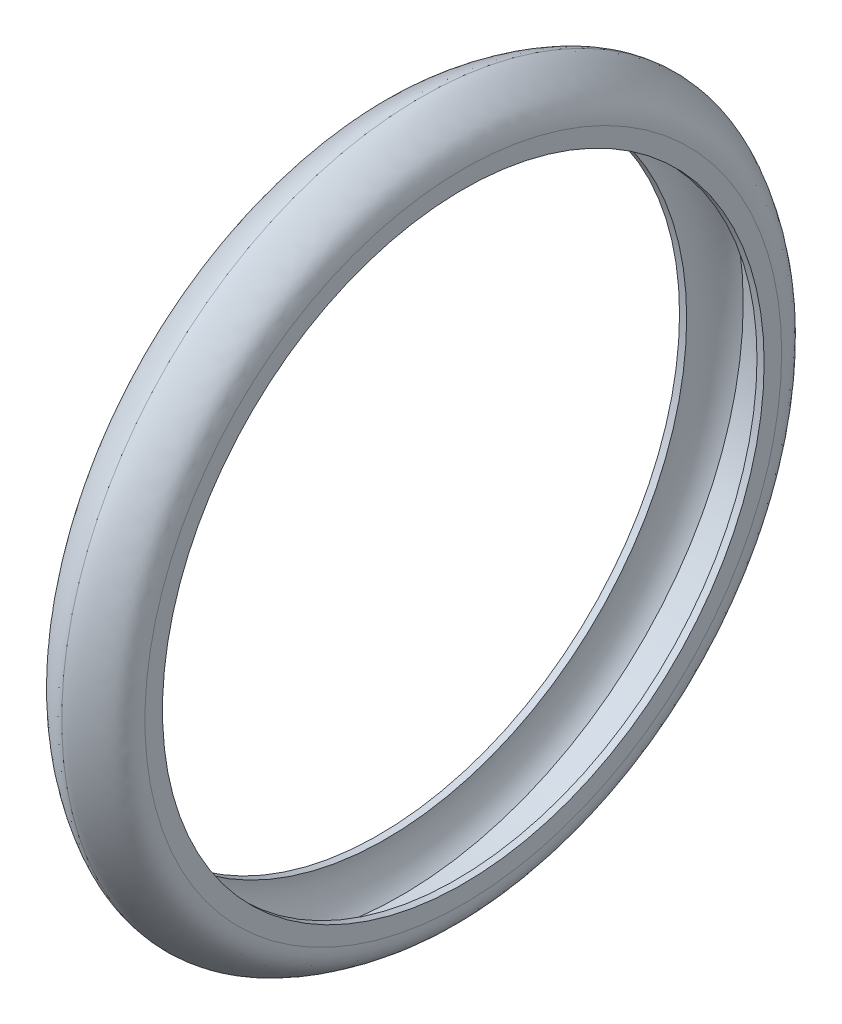
ISO-10303-21;
HEADER;
FILE_DESCRIPTION(('STEP AP214'),'2;1');
FILE_NAME('part.step','',(''),(''),'','','');
FILE_SCHEMA(('AUTOMOTIVE_DESIGN { 1 0 10303 214 1 1 1 1 }'));
ENDSEC;
DATA;
#1=APPLICATION_CONTEXT('core data for automotive mechanical design processes');
#2=APPLICATION_PROTOCOL_DEFINITION('international standard','automotive_design',2000,#1);
#3=PRODUCT_CONTEXT('',#1,'mechanical');
#4=PRODUCT('Part','Part','',(#3));
#5=PRODUCT_RELATED_PRODUCT_CATEGORY('part','',(#4));
#6=PRODUCT_DEFINITION_FORMATION('','',#4);
#7=PRODUCT_DEFINITION_CONTEXT('part definition',#1,'design');
#8=PRODUCT_DEFINITION('design','',#6,#7);
#9=PRODUCT_DEFINITION_SHAPE('','',#8);
#10=(LENGTH_UNIT() NAMED_UNIT(*) SI_UNIT(.MILLI.,.METRE.));
#11=(NAMED_UNIT(*) PLANE_ANGLE_UNIT() SI_UNIT($,.RADIAN.));
#12=(NAMED_UNIT(*) SI_UNIT($,.STERADIAN.) SOLID_ANGLE_UNIT());
#13=UNCERTAINTY_MEASURE_WITH_UNIT(LENGTH_MEASURE(1.E-05),#10,'distance_accuracy_value','');
#14=(GEOMETRIC_REPRESENTATION_CONTEXT(3) GLOBAL_UNCERTAINTY_ASSIGNED_CONTEXT((#13)) GLOBAL_UNIT_ASSIGNED_CONTEXT((#10,
#11,#12)) REPRESENTATION_CONTEXT('',''));
#15=CARTESIAN_POINT('',(0.,0.,0.));
#16=DIRECTION('',(0.,0.,1.));
#17=DIRECTION('',(1.,0.,0.));
#18=AXIS2_PLACEMENT_3D('',#15,#16,#17);
#19=CARTESIAN_POINT('',(0.,34.128413698948,0.));
#20=CARTESIAN_POINT('',(0.661029516474814,34.1185736151305,0.));
#21=CARTESIAN_POINT('',(3.46934178996227,32.4506922049133,0.));
#22=CARTESIAN_POINT('',(4.01802735930678,31.5431855613167,0.));
#23=CARTESIAN_POINT('',(4.01802735930678,30.238684993996,0.));
#24=B_SPLINE_CURVE_WITH_KNOTS('',3,(#19,#20,#21,#22,#23),.UNSPECIFIED.,.F.,.F.,(4,1,4),
(0.504084478643908,0.667615186676427,1.),.UNSPECIFIED.);
#25=CARTESIAN_POINT('',(15.5774448689001,0.,0.));
#26=DIRECTION('',(1.,0.,0.));
#27=AXIS1_PLACEMENT('',#25,#26);
#28=SURFACE_OF_REVOLUTION('',#24,#27);
#29=CARTESIAN_POINT('',(4.01802735930678,0.,0.));
#30=DIRECTION('',(1.,0.,0.));
#31=DIRECTION('',(0.,0.,-1.));
#32=AXIS2_PLACEMENT_3D('',#29,#30,#31);
#33=CIRCLE('',#32,30.238684993996);
#34=CARTESIAN_POINT('',(4.01802735930678,0.,-30.238684993996));
#35=VERTEX_POINT('',#34);
#36=EDGE_CURVE('E64',#35,#35,#33,.T.);
#37=ORIENTED_EDGE('',*,*,#36,.F.);
#38=EDGE_LOOP('',(#37));
#39=FACE_BOUND('',#38,.T.);
#40=CARTESIAN_POINT('',(0.,0.,0.));
#41=DIRECTION('',(1.,0.,0.));
#42=DIRECTION('',(0.,0.,-1.));
#43=AXIS2_PLACEMENT_3D('',#40,#41,#42);
#44=CIRCLE('',#43,34.128413698948);
#45=CARTESIAN_POINT('',(0.,0.,-34.128413698948));
#46=VERTEX_POINT('',#45);
#47=EDGE_CURVE('E10',#46,#46,#44,.T.);
#48=ORIENTED_EDGE('',*,*,#47,.T.);
#49=EDGE_LOOP('',(#48));
#50=FACE_BOUND('',#49,.T.);
#51=ADVANCED_FACE('F32',(#39,#50),#28,.T.);
#52=CARTESIAN_POINT('',(0.,34.128413698948,0.));
#53=CARTESIAN_POINT('',(-0.661029516474814,34.1185736151305,0.));
#54=CARTESIAN_POINT('',(-3.46934178996227,32.4506922049133,0.));
#55=CARTESIAN_POINT('',(-4.01802735930678,31.5431855613167,0.));
#56=CARTESIAN_POINT('',(-4.01802735930678,30.238684993996,0.));
#57=B_SPLINE_CURVE_WITH_KNOTS('',3,(#52,#53,#54,#55,#56),.UNSPECIFIED.,.F.,.F.,(4,1,4),
(0.504084478643908,0.667615186676427,1.),.UNSPECIFIED.);
#58=CARTESIAN_POINT('',(15.5774448689001,0.,0.));
#59=DIRECTION('',(1.,0.,0.));
#60=AXIS1_PLACEMENT('',#58,#59);
#61=SURFACE_OF_REVOLUTION('',#57,#60);
#62=CARTESIAN_POINT('',(-4.01802735930678,0.,0.));
#63=DIRECTION('',(1.,0.,0.));
#64=DIRECTION('',(0.,0.,-1.));
#65=AXIS2_PLACEMENT_3D('',#62,#63,#64);
#66=CIRCLE('',#65,30.238684993996);
#67=CARTESIAN_POINT('',(-4.01802735930678,0.,-30.238684993996));
#68=VERTEX_POINT('',#67);
#69=EDGE_CURVE('E39',#68,#68,#66,.T.);
#70=ORIENTED_EDGE('',*,*,#69,.T.);
#71=EDGE_LOOP('',(#70));
#72=FACE_BOUND('',#71,.T.);
#73=ORIENTED_EDGE('',*,*,#47,.F.);
#74=EDGE_LOOP('',(#73));
#75=FACE_BOUND('',#74,.T.);
#76=ADVANCED_FACE('F76',(#72,#75),#61,.F.);
#77=CARTESIAN_POINT('',(-4.01802735930678,0.,0.));
#78=DIRECTION('',(-1.,0.,0.));
#79=DIRECTION('',(0.,0.,1.));
#80=AXIS2_PLACEMENT_3D('',#77,#78,#79);
#81=PLANE('',#80);
#82=CARTESIAN_POINT('',(-4.01802735930678,0.,0.));
#83=DIRECTION('',(1.,0.,0.));
#84=DIRECTION('',(0.,0.,-1.));
#85=AXIS2_PLACEMENT_3D('',#82,#83,#84);
#86=CIRCLE('',#85,28.575);
#87=CARTESIAN_POINT('',(-4.01802735930678,0.,-28.575));
#88=VERTEX_POINT('',#87);
#89=EDGE_CURVE('E43',#88,#88,#86,.T.);
#90=ORIENTED_EDGE('',*,*,#89,.T.);
#91=EDGE_LOOP('',(#90));
#92=FACE_BOUND('',#91,.T.);
#93=ORIENTED_EDGE('',*,*,#69,.F.);
#94=EDGE_LOOP('',(#93));
#95=FACE_BOUND('',#94,.T.);
#96=ADVANCED_FACE('F79',(#92,#95),#81,.T.);
#97=CARTESIAN_POINT('',(15.5774448689001,0.,0.));
#98=DIRECTION('',(1.,0.,0.));
#99=DIRECTION('',(0.,0.,-1.));
#100=AXIS2_PLACEMENT_3D('',#97,#98,#99);
#101=CYLINDRICAL_SURFACE('',#100,28.575);
#102=CARTESIAN_POINT('',(-3.33915848262085,0.,0.));
#103=DIRECTION('',(1.,0.,0.));
#104=DIRECTION('',(0.,0.,-1.));
#105=AXIS2_PLACEMENT_3D('',#102,#103,#104);
#106=CIRCLE('',#105,28.575);
#107=CARTESIAN_POINT('',(-3.33915848262085,0.,-28.575));
#108=VERTEX_POINT('',#107);
#109=EDGE_CURVE('E47',#108,#108,#106,.T.);
#110=ORIENTED_EDGE('',*,*,#109,.T.);
#111=EDGE_LOOP('',(#110));
#112=FACE_BOUND('',#111,.T.);
#113=ORIENTED_EDGE('',*,*,#89,.F.);
#114=EDGE_LOOP('',(#113));
#115=FACE_BOUND('',#114,.T.);
#116=ADVANCED_FACE('F82',(#112,#115),#101,.F.);
#117=CARTESIAN_POINT('',(1.14363505867841,0.,0.));
#118=DIRECTION('',(1.,0.,0.));
#119=DIRECTION('',(0.,0.,-1.));
#120=AXIS2_PLACEMENT_3D('',#117,#118,#119);
#121=TOROIDAL_SURFACE('',#120,29.1717369554342,4.5223371090505);
#122=ORIENTED_EDGE('',*,*,#109,.F.);
#123=EDGE_LOOP('',(#122));
#124=FACE_BOUND('',#123,.T.);
#125=CARTESIAN_POINT('',(-1.905,0.,0.));
#126=DIRECTION('',(1.,0.,0.));
#127=DIRECTION('',(0.,0.,-1.));
#128=AXIS2_PLACEMENT_3D('',#125,#126,#127);
#129=CIRCLE('',#128,32.512);
#130=CARTESIAN_POINT('',(-1.905,0.,-32.512));
#131=VERTEX_POINT('',#130);
#132=EDGE_CURVE('E52',#131,#131,#129,.T.);
#133=ORIENTED_EDGE('',*,*,#132,.T.);
#134=EDGE_LOOP('',(#133));
#135=FACE_BOUND('',#134,.T.);
#136=ADVANCED_FACE('F86',(#124,#135),#121,.F.);
#137=CARTESIAN_POINT('',(15.5774448689001,0.,0.));
#138=DIRECTION('',(1.,0.,0.));
#139=DIRECTION('',(0.,0.,-1.));
#140=AXIS2_PLACEMENT_3D('',#137,#138,#139);
#141=CYLINDRICAL_SURFACE('',#140,32.512);
#142=ORIENTED_EDGE('',*,*,#132,.F.);
#143=EDGE_LOOP('',(#142));
#144=FACE_BOUND('',#143,.T.);
#145=CARTESIAN_POINT('',(1.905,0.,0.));
#146=DIRECTION('',(1.,0.,0.));
#147=DIRECTION('',(0.,0.,-1.));
#148=AXIS2_PLACEMENT_3D('',#145,#146,#147);
#149=CIRCLE('',#148,32.512);
#150=CARTESIAN_POINT('',(1.905,0.,-32.512));
#151=VERTEX_POINT('',#150);
#152=EDGE_CURVE('E55',#151,#151,#149,.T.);
#153=ORIENTED_EDGE('',*,*,#152,.T.);
#154=EDGE_LOOP('',(#153));
#155=FACE_BOUND('',#154,.T.);
#156=ADVANCED_FACE('F90',(#144,#155),#141,.F.);
#157=CARTESIAN_POINT('',(-1.14363505867841,0.,0.));
#158=DIRECTION('',(1.,0.,0.));
#159=DIRECTION('',(0.,0.,-1.));
#160=AXIS2_PLACEMENT_3D('',#157,#158,#159);
#161=TOROIDAL_SURFACE('',#160,29.1717369554342,4.5223371090505);
#162=CARTESIAN_POINT('',(3.33915848262085,0.,0.));
#163=DIRECTION('',(1.,0.,0.));
#164=DIRECTION('',(0.,0.,-1.));
#165=AXIS2_PLACEMENT_3D('',#162,#163,#164);
#166=CIRCLE('',#165,28.575);
#167=CARTESIAN_POINT('',(3.33915848262085,0.,-28.575));
#168=VERTEX_POINT('',#167);
#169=EDGE_CURVE('E58',#168,#168,#166,.T.);
#170=ORIENTED_EDGE('',*,*,#169,.T.);
#171=EDGE_LOOP('',(#170));
#172=FACE_BOUND('',#171,.T.);
#173=ORIENTED_EDGE('',*,*,#152,.F.);
#174=EDGE_LOOP('',(#173));
#175=FACE_BOUND('',#174,.T.);
#176=ADVANCED_FACE('F94',(#172,#175),#161,.F.);
#177=CARTESIAN_POINT('',(15.5774448689001,0.,0.));
#178=DIRECTION('',(1.,0.,0.));
#179=DIRECTION('',(0.,0.,-1.));
#180=AXIS2_PLACEMENT_3D('',#177,#178,#179);
#181=CYLINDRICAL_SURFACE('',#180,28.575);
#182=ORIENTED_EDGE('',*,*,#169,.F.);
#183=EDGE_LOOP('',(#182));
#184=FACE_BOUND('',#183,.T.);
#185=CARTESIAN_POINT('',(4.01802735930678,0.,0.));
#186=DIRECTION('',(1.,0.,0.));
#187=DIRECTION('',(0.,0.,-1.));
#188=AXIS2_PLACEMENT_3D('',#185,#186,#187);
#189=CIRCLE('',#188,28.575);
#190=CARTESIAN_POINT('',(4.01802735930678,0.,-28.575));
#191=VERTEX_POINT('',#190);
#192=EDGE_CURVE('E61',#191,#191,#189,.T.);
#193=ORIENTED_EDGE('',*,*,#192,.T.);
#194=EDGE_LOOP('',(#193));
#195=FACE_BOUND('',#194,.T.);
#196=ADVANCED_FACE('F98',(#184,#195),#181,.F.);
#197=CARTESIAN_POINT('',(4.01802735930678,0.,0.));
#198=DIRECTION('',(-1.,0.,0.));
#199=DIRECTION('',(0.,0.,1.));
#200=AXIS2_PLACEMENT_3D('',#197,#198,#199);
#201=PLANE('',#200);
#202=ORIENTED_EDGE('',*,*,#192,.F.);
#203=EDGE_LOOP('',(#202));
#204=FACE_BOUND('',#203,.T.);
#205=ORIENTED_EDGE('',*,*,#36,.T.);
#206=EDGE_LOOP('',(#205));
#207=FACE_BOUND('',#206,.T.);
#208=ADVANCED_FACE('F102',(#204,#207),#201,.F.);
#209=CLOSED_SHELL('',(#51,#76,#96,#116,#136,#156,#176,#196,#208));
#210=MANIFOLD_SOLID_BREP('B2',#209);
#211=ADVANCED_BREP_SHAPE_REPRESENTATION('',(#18,#210),#14);
#212=SHAPE_DEFINITION_REPRESENTATION(#9,#211);
ENDSEC;
END-ISO-10303-21;
